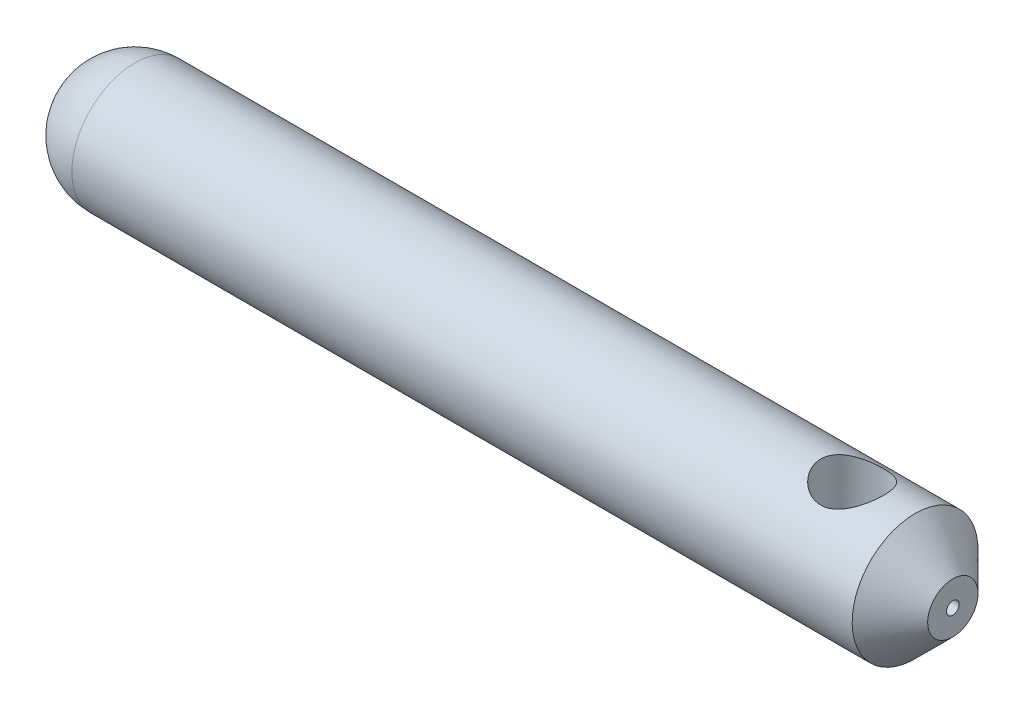
ISO-10303-21;
HEADER;
FILE_DESCRIPTION(('STEP AP214'),'2;1');
FILE_NAME('part.step','',(''),(''),'','','');
FILE_SCHEMA(('AUTOMOTIVE_DESIGN { 1 0 10303 214 1 1 1 1 }'));
ENDSEC;
DATA;
#1=APPLICATION_CONTEXT('core data for automotive mechanical design processes');
#2=APPLICATION_PROTOCOL_DEFINITION('international standard','automotive_design',2000,#1);
#3=PRODUCT_CONTEXT('',#1,'mechanical');
#4=PRODUCT('Part','Part','',(#3));
#5=PRODUCT_RELATED_PRODUCT_CATEGORY('part','',(#4));
#6=PRODUCT_DEFINITION_FORMATION('','',#4);
#7=PRODUCT_DEFINITION_CONTEXT('part definition',#1,'design');
#8=PRODUCT_DEFINITION('design','',#6,#7);
#9=PRODUCT_DEFINITION_SHAPE('','',#8);
#10=(LENGTH_UNIT() NAMED_UNIT(*) SI_UNIT(.MILLI.,.METRE.));
#11=(NAMED_UNIT(*) PLANE_ANGLE_UNIT() SI_UNIT($,.RADIAN.));
#12=(NAMED_UNIT(*) SI_UNIT($,.STERADIAN.) SOLID_ANGLE_UNIT());
#13=UNCERTAINTY_MEASURE_WITH_UNIT(LENGTH_MEASURE(1.E-05),#10,'distance_accuracy_value','');
#14=(GEOMETRIC_REPRESENTATION_CONTEXT(3) GLOBAL_UNCERTAINTY_ASSIGNED_CONTEXT((#13)) GLOBAL_UNIT_ASSIGNED_CONTEXT((#10,
#11,#12)) REPRESENTATION_CONTEXT('',''));
#15=CARTESIAN_POINT('',(0.,0.,0.));
#16=DIRECTION('',(0.,0.,1.));
#17=DIRECTION('',(1.,0.,0.));
#18=AXIS2_PLACEMENT_3D('',#15,#16,#17);
#19=CARTESIAN_POINT('',(-1.90397170928587,-0.388772550549885,0.));
#20=DIRECTION('',(1.,0.,0.));
#21=DIRECTION('',(0.,1.,0.));
#22=AXIS2_PLACEMENT_3D('',#19,#20,#21);
#23=SPHERICAL_SURFACE('',#22,5.);
#24=CARTESIAN_POINT('',(-1.90397170928587,-0.388772550549885,0.));
#25=DIRECTION('',(1.,0.,0.));
#26=DIRECTION('',(0.,1.,0.));
#27=AXIS2_PLACEMENT_3D('',#24,#25,#26);
#28=CIRCLE('',#27,5.);
#29=CARTESIAN_POINT('',(-1.90397170928587,4.61122744945011,0.));
#30=VERTEX_POINT('',#29);
#31=EDGE_CURVE('E10',#30,#30,#28,.T.);
#32=ORIENTED_EDGE('',*,*,#31,.F.);
#33=EDGE_LOOP('',(#32));
#34=FACE_BOUND('',#33,.T.);
#35=ADVANCED_FACE('F30',(#34),#23,.T.);
#36=CARTESIAN_POINT('',(63.0960282907141,-0.388772550549876,0.));
#37=DIRECTION('',(1.,0.,0.));
#38=DIRECTION('',(0.,1.,0.));
#39=AXIS2_PLACEMENT_3D('',#36,#37,#38);
#40=CYLINDRICAL_SURFACE('',#39,5.);
#41=CARTESIAN_POINT('',(52.5960282907141,4.61122744945012,0.));
#42=CARTESIAN_POINT('',(52.5960379597702,4.61121922495484,0.131426682334305));
#43=CARTESIAN_POINT('',(52.6064538524882,4.60598944080289,0.263015634437213));
#44=CARTESIAN_POINT('',(52.6476601118762,4.58558163506031,0.522301454622883));
#45=CARTESIAN_POINT('',(52.6784891716392,4.57038472132682,0.649990448564105));
#46=CARTESIAN_POINT('',(52.759012913433,4.53163435867489,0.897333631316202));
#47=CARTESIAN_POINT('',(52.8086342784969,4.50811340852271,1.01701694536277));
#48=CARTESIAN_POINT('',(52.9249548169659,4.45487188270839,1.24618160399671));
#49=CARTESIAN_POINT('',(52.9916526438592,4.42515179589433,1.3556637520377));
#50=CARTESIAN_POINT('',(53.1448214223568,4.36013389995643,1.56876952630998));
#51=CARTESIAN_POINT('',(53.2322444909439,4.32460742604102,1.67163802294308));
#52=CARTESIAN_POINT('',(53.4223319866994,4.25272670721743,1.86194861703333));
#53=CARTESIAN_POINT('',(53.5250079195542,4.21637185511909,1.94937895911556));
#54=CARTESIAN_POINT('',(53.7522366651594,4.14370122890633,2.11312999967247));
#55=CARTESIAN_POINT('',(53.8778685367492,4.10760712357578,2.18806333849064));
#56=CARTESIAN_POINT('',(54.1419466305096,4.04337691888567,2.31542056761491));
#57=CARTESIAN_POINT('',(54.2803836124768,4.01523513965804,2.36786053751683));
#58=CARTESIAN_POINT('',(54.5576910543106,3.97267412536413,2.44533110537653));
#59=CARTESIAN_POINT('',(54.6960394208937,3.95753423903464,2.47181464267578));
#60=CARTESIAN_POINT('',(54.9759753851517,3.94077469817162,2.50106748329741));
#61=CARTESIAN_POINT('',(55.1175596428892,3.93914168303441,2.50386022093906));
#62=CARTESIAN_POINT('',(55.381743351505,3.94900070587948,2.48671821792512));
#63=CARTESIAN_POINT('',(55.5045883687724,3.95894654099996,2.46946139884055));
#64=CARTESIAN_POINT('',(55.7453330641461,3.98813316779687,2.41734962264384));
#65=CARTESIAN_POINT('',(55.8632311539773,4.00737692024466,2.38248905974454));
#66=CARTESIAN_POINT('',(56.0941011221285,4.0534143597685,2.29552445096459));
#67=CARTESIAN_POINT('',(56.2068942876787,4.08037346605004,2.24303766778988));
#68=CARTESIAN_POINT('',(56.4226140221891,4.13881255648525,2.12260421917012));
#69=CARTESIAN_POINT('',(56.5255361297144,4.17029456895489,2.0546506095312));
#70=CARTESIAN_POINT('',(56.7323314225722,4.23905639703225,1.89516513728193));
#71=CARTESIAN_POINT('',(56.8346704746546,4.27656520536877,1.80173614592319));
#72=CARTESIAN_POINT('',(57.0228668371914,4.3499180319603,1.59888894685344));
#73=CARTESIAN_POINT('',(57.1087162707989,4.38576124842015,1.48946314143572));
#74=CARTESIAN_POINT('',(57.2652424432885,4.45377713152421,1.25129126457962));
#75=CARTESIAN_POINT('',(57.3350294718285,4.48570205350027,1.12188397899853));
#76=CARTESIAN_POINT('',(57.4512708633217,4.5401744774812,0.851165538721987));
#77=CARTESIAN_POINT('',(57.497743753252,4.56272942303905,0.709863940663163));
#78=CARTESIAN_POINT('',(57.5622168000058,4.59433579298591,0.431916229151782));
#79=CARTESIAN_POINT('',(57.5822563800811,4.60435090698252,0.295853826370908));
#80=CARTESIAN_POINT('',(57.5996901185503,4.61305278592805,0.0219489998732918));
#81=CARTESIAN_POINT('',(57.5970950048126,4.61174491748438,-0.115892549675105));
#82=CARTESIAN_POINT('',(57.5705115696674,4.5985072557848,-0.378082429964652));
#83=CARTESIAN_POINT('',(57.5481969588897,4.58740859165004,-0.502648520123703));
#84=CARTESIAN_POINT('',(57.4854331109758,4.55678173232541,-0.746017230755969));
#85=CARTESIAN_POINT('',(57.4449818745783,4.53725260782636,-0.86481921423188));
#86=CARTESIAN_POINT('',(57.3460321246338,4.49083373477341,-1.09722152111964));
#87=CARTESIAN_POINT('',(57.2870506654318,4.46374949362885,-1.2105759924983));
#88=CARTESIAN_POINT('',(57.1532594515893,4.40482680744762,-1.42615340426438));
#89=CARTESIAN_POINT('',(57.0784429541943,4.37298633885546,-1.52837157450203));
#90=CARTESIAN_POINT('',(56.9066272274233,4.30393298260099,-1.72941922315487));
#91=CARTESIAN_POINT('',(56.8081711197389,4.266499569545,-1.82693019428495));
#92=CARTESIAN_POINT('',(56.5962154126647,4.19278723866599,-2.00464080257219));
#93=CARTESIAN_POINT('',(56.4827054936443,4.15650913417419,-2.08482846428685));
#94=CARTESIAN_POINT('',(56.2369191552295,4.08750725490291,-2.22926978618995));
#95=CARTESIAN_POINT('',(56.104000125423,4.05504068926266,-2.29256373922244));
#96=CARTESIAN_POINT('',(55.8272531218316,4.00057925671757,-2.39520706511459));
#97=CARTESIAN_POINT('',(55.6834394747142,3.97857090494026,-2.43458729077056));
#98=CARTESIAN_POINT('',(55.4037527333512,3.95026497514363,-2.48465421767005));
#99=CARTESIAN_POINT('',(55.2684426565952,3.94266203619108,-2.49773248744361));
#100=CARTESIAN_POINT('',(54.9974106233335,3.9403613153759,-2.50172288950899));
#101=CARTESIAN_POINT('',(54.8616888708405,3.94565793970122,-2.49264462983266));
#102=CARTESIAN_POINT('',(54.6073195350973,3.96717400109675,-2.45481530197332));
#103=CARTESIAN_POINT('',(54.4882771089934,3.98230481283144,-2.42802074302696));
#104=CARTESIAN_POINT('',(54.2565079985142,4.02050285282614,-2.35793843840544));
#105=CARTESIAN_POINT('',(54.1437833591476,4.04357263379977,-2.31464538728733));
#106=CARTESIAN_POINT('',(53.9194661379944,4.09694071378424,-2.20953919315539));
#107=CARTESIAN_POINT('',(53.8084584389791,4.12762052943461,-2.14667719009404));
#108=CARTESIAN_POINT('',(53.5978420474741,4.19211072022467,-2.00537808387991));
#109=CARTESIAN_POINT('',(53.4982393280854,4.22592271915778,-1.92693287765889));
#110=CARTESIAN_POINT('',(53.3006729269645,4.29778561272022,-1.74550556946066));
#111=CARTESIAN_POINT('',(53.2043789265428,4.33585236459992,-1.6407002246921));
#112=CARTESIAN_POINT('',(53.0303724412861,4.40817092328557,-1.41539785420685));
#113=CARTESIAN_POINT('',(52.9526699721083,4.44242066850458,-1.29489242426333));
#114=CARTESIAN_POINT('',(52.81793131123,4.50367894402794,-1.03978808878537));
#115=CARTESIAN_POINT('',(52.7610451229297,4.530634563825,-0.905095560782295));
#116=CARTESIAN_POINT('',(52.6938444319218,4.56300705868362,-0.69632870925736));
#117=CARTESIAN_POINT('',(52.6744728927123,4.57245059026886,-0.625670413494097));
#118=CARTESIAN_POINT('',(52.6419623423435,4.58839872220112,-0.482623997839266));
#119=CARTESIAN_POINT('',(52.6288195240378,4.59490511768171,-0.410236963092408));
#120=CARTESIAN_POINT('',(52.6112908184295,4.60360945711142,-0.281518684621676));
#121=CARTESIAN_POINT('',(52.6055733541828,4.60646033411466,-0.225408499555448));
#122=CARTESIAN_POINT('',(52.5979399612484,4.6102711227467,-0.11287552845629));
#123=CARTESIAN_POINT('',(52.5960241374887,4.61123098218209,-0.0564527338382188));
#124=CARTESIAN_POINT('',(52.5960282907141,4.61122744945012,0.));
#125=B_SPLINE_CURVE_WITH_KNOTS('',3,(#41,#42,#43,#44,#45,#46,#47,#48,#49,#50,#51,#52,#53,#54,
#55,#56,#57,#58,#59,#60,#61,#62,#63,#64,#65,#66,#67,#68,#69,#70,#71,#72,#73,#74,#75,#76,#77,#78,
#79,#80,#81,#82,#83,#84,#85,#86,#87,#88,#89,#90,#91,#92,#93,#94,#95,#96,#97,#98,#99,#100,#101,
#102,#103,#104,#105,#106,#107,#108,#109,#110,#111,#112,#113,#114,#115,#116,#117,#118,#119,#120,
#121,#122,#123,#124),.UNSPECIFIED.,.T.,.F.,(4,2,2,2,2,2,2,2,2,2,2,2,2,2,2,2,2,2,2,2,2,2,2,2,2,2,
2,2,2,2,2,2,2,2,2,2,2,2,2,2,2,4),(0.,0.394060643550731,0.788870374272994,1.18215538873075,
1.57540940145392,1.99245439679523,2.40981559413509,2.85954316076882,3.30894869745702,
3.73145030350574,4.15353393322552,4.52514281023301,4.89687009814197,5.27725600421219,
5.65781303150555,6.08662353334697,6.51563836496716,6.96457555536102,7.41315542280699,
7.82458226178364,8.2358141127869,8.61517266265305,8.99457304077329,9.38482140069747,
9.77523626870848,10.2039902661037,10.6330397153795,11.0828670540368,11.53211279863,
11.9382326875699,12.3441764966107,12.7114482562151,13.0788382197025,13.4709114195009,
13.8631890285845,14.303131068923,14.7433095845248,15.1866003415819,15.407934939208,
15.6291340766843,15.7983933645035,15.9676573239323),.UNSPECIFIED.);
#126=CARTESIAN_POINT('',(52.5960282907141,4.61122744945012,0.));
#127=VERTEX_POINT('',#126);
#128=EDGE_CURVE('E69',#127,#127,#125,.T.);
#129=ORIENTED_EDGE('',*,*,#128,.F.);
#130=EDGE_LOOP('',(#129));
#131=FACE_BOUND('',#130,.T.);
#132=CARTESIAN_POINT('',(52.5960282907141,-5.38877255054987,0.));
#133=CARTESIAN_POINT('',(52.5960379597702,-5.38876432605459,-0.131426682334305));
#134=CARTESIAN_POINT('',(52.6064538524882,-5.38353454190265,-0.263015634437213));
#135=CARTESIAN_POINT('',(52.6476601118762,-5.36312673616007,-0.522301454622883));
#136=CARTESIAN_POINT('',(52.6784891716392,-5.34792982242658,-0.649990448564105));
#137=CARTESIAN_POINT('',(52.759012913433,-5.30917945977464,-0.897333631316203));
#138=CARTESIAN_POINT('',(52.8086342784969,-5.28565850962247,-1.01701694536277));
#139=CARTESIAN_POINT('',(52.9249548169659,-5.23241698380815,-1.24618160399671));
#140=CARTESIAN_POINT('',(52.9916526438592,-5.20269689699408,-1.3556637520377));
#141=CARTESIAN_POINT('',(53.1448214223568,-5.13767900105619,-1.56876952630998));
#142=CARTESIAN_POINT('',(53.2322444909439,-5.10215252714078,-1.67163802294308));
#143=CARTESIAN_POINT('',(53.4223319866994,-5.03027180831718,-1.86194861703332));
#144=CARTESIAN_POINT('',(53.5250079195542,-4.99391695621885,-1.94937895911555));
#145=CARTESIAN_POINT('',(53.7522366651594,-4.92124633000609,-2.11312999967247));
#146=CARTESIAN_POINT('',(53.8778685367492,-4.88515222467554,-2.18806333849064));
#147=CARTESIAN_POINT('',(54.1419466305096,-4.82092201998542,-2.31542056761491));
#148=CARTESIAN_POINT('',(54.2803836124768,-4.79278024075779,-2.36786053751683));
#149=CARTESIAN_POINT('',(54.5576910543106,-4.75021922646389,-2.44533110537653));
#150=CARTESIAN_POINT('',(54.6960394208937,-4.73507934013439,-2.47181464267578));
#151=CARTESIAN_POINT('',(54.9759753851518,-4.71831979927137,-2.50106748329741));
#152=CARTESIAN_POINT('',(55.1175596428892,-4.71668678413417,-2.50386022093906));
#153=CARTESIAN_POINT('',(55.381743351505,-4.72654580697924,-2.48671821792512));
#154=CARTESIAN_POINT('',(55.5045883687724,-4.73649164209971,-2.46946139884055));
#155=CARTESIAN_POINT('',(55.7453330641461,-4.76567826889662,-2.41734962264384));
#156=CARTESIAN_POINT('',(55.8632311539773,-4.78492202134441,-2.38248905974454));
#157=CARTESIAN_POINT('',(56.0941011221285,-4.83095946086826,-2.29552445096459));
#158=CARTESIAN_POINT('',(56.2068942876787,-4.8579185671498,-2.24303766778988));
#159=CARTESIAN_POINT('',(56.4226140221891,-4.916357657585,-2.12260421917012));
#160=CARTESIAN_POINT('',(56.5255361297144,-4.94783967005465,-2.0546506095312));
#161=CARTESIAN_POINT('',(56.7323314225722,-5.016601498132,-1.89516513728194));
#162=CARTESIAN_POINT('',(56.8346704746546,-5.05411030646852,-1.8017361459232));
#163=CARTESIAN_POINT('',(57.0228668371914,-5.12746313306006,-1.59888894685345));
#164=CARTESIAN_POINT('',(57.1087162707989,-5.1633063495199,-1.48946314143572));
#165=CARTESIAN_POINT('',(57.2652424432885,-5.23132223262396,-1.25129126457963));
#166=CARTESIAN_POINT('',(57.3350294718285,-5.26324715460002,-1.12188397899853));
#167=CARTESIAN_POINT('',(57.4512708633217,-5.31771957858096,-0.851165538721991));
#168=CARTESIAN_POINT('',(57.497743753252,-5.34027452413881,-0.709863940663168));
#169=CARTESIAN_POINT('',(57.5622168000058,-5.37188089408566,-0.431916229151785));
#170=CARTESIAN_POINT('',(57.5822563800811,-5.38189600808227,-0.29585382637091));
#171=CARTESIAN_POINT('',(57.5996901185503,-5.39059788702781,-0.0219489998732912));
#172=CARTESIAN_POINT('',(57.5970950048126,-5.38929001858413,0.115892549675107));
#173=CARTESIAN_POINT('',(57.5705115696675,-5.37605235688456,0.378082429964653));
#174=CARTESIAN_POINT('',(57.5481969588897,-5.3649536927498,0.502648520123703));
#175=CARTESIAN_POINT('',(57.4854331109758,-5.33432683342516,0.746017230755969));
#176=CARTESIAN_POINT('',(57.4449818745783,-5.31479770892612,0.86481921423188));
#177=CARTESIAN_POINT('',(57.3460321246338,-5.26837883587316,1.09722152111964));
#178=CARTESIAN_POINT('',(57.2870506654318,-5.24129459472861,1.21057599249831));
#179=CARTESIAN_POINT('',(57.1532594515893,-5.18237190854738,1.42615340426438));
#180=CARTESIAN_POINT('',(57.0784429541943,-5.15053143995521,1.52837157450203));
#181=CARTESIAN_POINT('',(56.9066272274233,-5.08147808370074,1.72941922315487));
#182=CARTESIAN_POINT('',(56.8081711197389,-5.04404467064475,1.82693019428495));
#183=CARTESIAN_POINT('',(56.5962154126647,-4.97033233976575,2.0046408025722));
#184=CARTESIAN_POINT('',(56.4827054936443,-4.93405423527394,2.08482846428685));
#185=CARTESIAN_POINT('',(56.2369191552295,-4.86505235600267,2.22926978618995));
#186=CARTESIAN_POINT('',(56.104000125423,-4.83258579036241,2.29256373922243));
#187=CARTESIAN_POINT('',(55.8272531218316,-4.77812435781733,2.39520706511459));
#188=CARTESIAN_POINT('',(55.6834394747142,-4.75611600604001,2.43458729077056));
#189=CARTESIAN_POINT('',(55.4037527333512,-4.72781007624338,2.48465421767005));
#190=CARTESIAN_POINT('',(55.2684426565952,-4.72020713729083,2.49773248744361));
#191=CARTESIAN_POINT('',(54.9974106233335,-4.71790641647566,2.50172288950899));
#192=CARTESIAN_POINT('',(54.8616888708405,-4.72320304080097,2.49264462983266));
#193=CARTESIAN_POINT('',(54.6073195350973,-4.7447191021965,2.45481530197332));
#194=CARTESIAN_POINT('',(54.4882771089934,-4.7598499139312,2.42802074302696));
#195=CARTESIAN_POINT('',(54.2565079985142,-4.7980479539259,2.35793843840544));
#196=CARTESIAN_POINT('',(54.1437833591476,-4.82111773489952,2.31464538728732));
#197=CARTESIAN_POINT('',(53.9194661379944,-4.874485814884,2.20953919315538));
#198=CARTESIAN_POINT('',(53.8084584389791,-4.90516563053437,2.14667719009404));
#199=CARTESIAN_POINT('',(53.5978420474741,-4.96965582132442,2.0053780838799));
#200=CARTESIAN_POINT('',(53.4982393280854,-5.00346782025754,1.92693287765889));
#201=CARTESIAN_POINT('',(53.3006729269645,-5.07533071381998,1.74550556946066));
#202=CARTESIAN_POINT('',(53.2043789265428,-5.11339746569967,1.6407002246921));
#203=CARTESIAN_POINT('',(53.0303724412861,-5.18571602438532,1.41539785420684));
#204=CARTESIAN_POINT('',(52.9526699721083,-5.21996576960433,1.29489242426333));
#205=CARTESIAN_POINT('',(52.81793131123,-5.28122404512769,1.03978808878537));
#206=CARTESIAN_POINT('',(52.7610451229297,-5.30817966492475,0.905095560782296));
#207=CARTESIAN_POINT('',(52.6938444319218,-5.34055215978338,0.696328709257361));
#208=CARTESIAN_POINT('',(52.6744728927123,-5.34999569136861,0.625670413494098));
#209=CARTESIAN_POINT('',(52.6419623423435,-5.36594382330088,0.482623997839267));
#210=CARTESIAN_POINT('',(52.6288195240378,-5.37245021878146,0.41023696309241));
#211=CARTESIAN_POINT('',(52.6112908184295,-5.38115455821117,0.281518684621679));
#212=CARTESIAN_POINT('',(52.6055733541828,-5.38400543521442,0.225408499555451));
#213=CARTESIAN_POINT('',(52.5979399612484,-5.38781622384646,0.112875528456293));
#214=CARTESIAN_POINT('',(52.5960241374887,-5.38877608328185,0.0564527338382199));
#215=CARTESIAN_POINT('',(52.5960282907141,-5.38877255054987,0.));
#216=B_SPLINE_CURVE_WITH_KNOTS('',3,(#132,#133,#134,#135,#136,#137,#138,#139,#140,#141,#142,
#143,#144,#145,#146,#147,#148,#149,#150,#151,#152,#153,#154,#155,#156,#157,#158,#159,#160,#161,
#162,#163,#164,#165,#166,#167,#168,#169,#170,#171,#172,#173,#174,#175,#176,#177,#178,#179,#180,
#181,#182,#183,#184,#185,#186,#187,#188,#189,#190,#191,#192,#193,#194,#195,#196,#197,#198,#199,
#200,#201,#202,#203,#204,#205,#206,#207,#208,#209,#210,#211,#212,#213,#214,#215),.UNSPECIFIED.,
.T.,.F.,(4,2,2,2,2,2,2,2,2,2,2,2,2,2,2,2,2,2,2,2,2,2,2,2,2,2,2,2,2,2,2,2,2,2,2,2,2,2,2,2,2,4),
(0.,0.394060643550732,0.788870374272993,1.18215538873074,1.57540940145392,1.99245439679522,
2.40981559413509,2.85954316076882,3.30894869745702,3.73145030350574,4.15353393322551,
4.52514281023303,4.89687009814197,5.27725600421219,5.65781303150555,6.08662353334697,
6.51563836496716,6.96457555536102,7.41315542280699,7.82458226178364,8.23581411278691,
8.61517266265305,8.99457304077329,9.38482140069747,9.77523626870849,10.2039902661037,
10.6330397153795,11.0828670540368,11.53211279863,11.9382326875699,12.3441764966107,
12.7114482562151,13.0788382197025,13.4709114195009,13.8631890285845,14.303131068923,
14.7433095845248,15.1866003415819,15.407934939208,15.6291340766843,15.7983933645035,
15.9676573239323),.UNSPECIFIED.);
#217=CARTESIAN_POINT('',(52.5960282907141,-5.38877255054987,0.));
#218=VERTEX_POINT('',#217);
#219=EDGE_CURVE('E74',#218,#218,#216,.T.);
#220=ORIENTED_EDGE('',*,*,#219,.F.);
#221=EDGE_LOOP('',(#220));
#222=FACE_BOUND('',#221,.T.);
#223=ORIENTED_EDGE('',*,*,#31,.T.);
#224=EDGE_LOOP('',(#223));
#225=FACE_BOUND('',#224,.T.);
#226=CARTESIAN_POINT('',(60.0960282907141,-0.388772550549877,0.));
#227=DIRECTION('',(1.,0.,0.));
#228=DIRECTION('',(0.,1.,0.));
#229=AXIS2_PLACEMENT_3D('',#226,#227,#228);
#230=CIRCLE('',#229,4.99999999999999);
#231=CARTESIAN_POINT('',(60.0960282907141,4.61122744945011,0.));
#232=VERTEX_POINT('',#231);
#233=EDGE_CURVE('E42',#232,#232,#230,.T.);
#234=ORIENTED_EDGE('',*,*,#233,.F.);
#235=EDGE_LOOP('',(#234));
#236=FACE_BOUND('',#235,.T.);
#237=ADVANCED_FACE('F79',(#131,#222,#225,#236),#40,.T.);
#238=CARTESIAN_POINT('',(63.0960282907141,-0.388772550549876,0.));
#239=DIRECTION('',(-1.,0.,0.));
#240=DIRECTION('',(0.,-1.,0.));
#241=AXIS2_PLACEMENT_3D('',#238,#239,#240);
#242=CONICAL_SURFACE('',#241,2.,0.785398163397449);
#243=ORIENTED_EDGE('',*,*,#233,.T.);
#244=EDGE_LOOP('',(#243));
#245=FACE_BOUND('',#244,.T.);
#246=CARTESIAN_POINT('',(63.0960282907141,-0.388772550549876,0.));
#247=DIRECTION('',(1.,0.,0.));
#248=DIRECTION('',(0.,1.,0.));
#249=AXIS2_PLACEMENT_3D('',#246,#247,#248);
#250=CIRCLE('',#249,2.);
#251=CARTESIAN_POINT('',(63.0960282907141,1.61122744945012,0.));
#252=VERTEX_POINT('',#251);
#253=EDGE_CURVE('E47',#252,#252,#250,.T.);
#254=ORIENTED_EDGE('',*,*,#253,.F.);
#255=EDGE_LOOP('',(#254));
#256=FACE_BOUND('',#255,.T.);
#257=ADVANCED_FACE('F83',(#245,#256),#242,.T.);
#258=CARTESIAN_POINT('',(63.0960282907141,1.61122744945012,0.));
#259=DIRECTION('',(1.,0.,0.));
#260=DIRECTION('',(0.,1.,0.));
#261=AXIS2_PLACEMENT_3D('',#258,#259,#260);
#262=PLANE('',#261);
#263=CARTESIAN_POINT('',(63.0960282907141,-0.388772550549876,0.));
#264=DIRECTION('',(1.,0.,0.));
#265=DIRECTION('',(0.,1.,0.));
#266=AXIS2_PLACEMENT_3D('',#263,#264,#265);
#267=CIRCLE('',#266,0.5);
#268=CARTESIAN_POINT('',(63.0960282907141,0.111227449450124,0.));
#269=VERTEX_POINT('',#268);
#270=EDGE_CURVE('E152',#269,#269,#267,.T.);
#271=ORIENTED_EDGE('',*,*,#270,.F.);
#272=EDGE_LOOP('',(#271));
#273=FACE_BOUND('',#272,.T.);
#274=ORIENTED_EDGE('',*,*,#253,.T.);
#275=EDGE_LOOP('',(#274));
#276=FACE_BOUND('',#275,.T.);
#277=ADVANCED_FACE('F87',(#273,#276),#262,.T.);
#278=CARTESIAN_POINT('',(3.09602829071413,-0.388772550549884,0.));
#279=DIRECTION('',(1.,0.,0.));
#280=DIRECTION('',(0.,1.,0.));
#281=AXIS2_PLACEMENT_3D('',#278,#279,#280);
#282=CYLINDRICAL_SURFACE('',#281,0.5);
#283=CARTESIAN_POINT('',(57.5960282907141,0.111227449450123,0.));
#284=CARTESIAN_POINT('',(57.5960277786185,0.11122642720095,-0.0277884533963166));
#285=CARTESIAN_POINT('',(57.5955602166053,0.1089030279663,-0.0555898301007611));
#286=CARTESIAN_POINT('',(57.5937401188303,0.0996781993925001,-0.11040675384451));
#287=CARTESIAN_POINT('',(57.5923868800151,0.0927731330493681,-0.137421658770678));
#288=CARTESIAN_POINT('',(57.5889465371056,0.0746068126397284,-0.189865152631656));
#289=CARTESIAN_POINT('',(57.5868601360977,0.0633497310277789,-0.215295233966567));
#290=CARTESIAN_POINT('',(57.5821802808907,0.0368113256944759,-0.263903994432112));
#291=CARTESIAN_POINT('',(57.5795868568927,0.0215302416465205,-0.287082807537906));
#292=CARTESIAN_POINT('',(57.574139117364,-0.0128417976955935,-0.330846738657432));
#293=CARTESIAN_POINT('',(57.5712820182359,-0.0319767282454774,-0.351396975579261));
#294=CARTESIAN_POINT('',(57.5656491929771,-0.0734187587457275,-0.389018378304013));
#295=CARTESIAN_POINT('',(57.5628734732163,-0.0957261062174359,-0.406089272385212));
#296=CARTESIAN_POINT('',(57.5576904997772,-0.143130647055814,-0.43641587667381));
#297=CARTESIAN_POINT('',(57.5552868275389,-0.168251372448056,-0.449635469432933));
#298=CARTESIAN_POINT('',(57.5511596310062,-0.220413460051916,-0.471652833290154));
#299=CARTESIAN_POINT('',(57.549436039524,-0.247454632223049,-0.480451041218619));
#300=CARTESIAN_POINT('',(57.5468923169752,-0.302314732503835,-0.493262649942413));
#301=CARTESIAN_POINT('',(57.5460606412501,-0.33011882262099,-0.497337248979388));
#302=CARTESIAN_POINT('',(57.5453601660173,-0.386027461232048,-0.50077606386306));
#303=CARTESIAN_POINT('',(57.5454912680533,-0.41413197870995,-0.50014076135675));
#304=CARTESIAN_POINT('',(57.5466910464551,-0.469395944560379,-0.494227286550909));
#305=CARTESIAN_POINT('',(57.547745555008,-0.496563253363534,-0.489019270121953));
#306=CARTESIAN_POINT('',(57.5506510215142,-0.549630588881378,-0.474218942311525));
#307=CARTESIAN_POINT('',(57.552502017503,-0.575530555009381,-0.46462642155034));
#308=CARTESIAN_POINT('',(57.5568063832162,-0.625530181401676,-0.44126239183736));
#309=CARTESIAN_POINT('',(57.5592637397827,-0.649616490334463,-0.427463075616057));
#310=CARTESIAN_POINT('',(57.5645013845795,-0.695157975536284,-0.39609678728634));
#311=CARTESIAN_POINT('',(57.567281709906,-0.716612848975456,-0.378529382178414));
#312=CARTESIAN_POINT('',(57.5729133969215,-0.756687251778345,-0.339749967280292));
#313=CARTESIAN_POINT('',(57.5757651367687,-0.775248834479442,-0.318478080606222));
#314=CARTESIAN_POINT('',(57.5811725342862,-0.808549473700489,-0.273092512031005));
#315=CARTESIAN_POINT('',(57.583728188159,-0.823288481196667,-0.248978793689695));
#316=CARTESIAN_POINT('',(57.5882617415186,-0.848536305162865,-0.19852969343946));
#317=CARTESIAN_POINT('',(57.5902387349555,-0.859038497372146,-0.17219090979265));
#318=CARTESIAN_POINT('',(57.5933853356534,-0.87545278756916,-0.118074488224332));
#319=CARTESIAN_POINT('',(57.5945550407168,-0.881365441586691,-0.0902970250362245));
#320=CARTESIAN_POINT('',(57.5959416500485,-0.888350777447016,-0.0345897028135751));
#321=CARTESIAN_POINT('',(57.5961741639765,-0.889502760320011,-0.00667016416278805));
#322=CARTESIAN_POINT('',(57.5957035503647,-0.887147621078787,0.048962467096357));
#323=CARTESIAN_POINT('',(57.5950004754214,-0.883640760873579,0.0766755712218965));
#324=CARTESIAN_POINT('',(57.5927474507542,-0.872133363777899,0.13085282997327));
#325=CARTESIAN_POINT('',(57.5912051727352,-0.864173516300926,0.157325974169951));
#326=CARTESIAN_POINT('',(57.5874460510193,-0.844030559221973,0.208561813749833));
#327=CARTESIAN_POINT('',(57.5852291567853,-0.831847133211462,0.233324380818769));
#328=CARTESIAN_POINT('',(57.5803278483806,-0.803431305224221,0.280770586843108));
#329=CARTESIAN_POINT('',(57.5776380428994,-0.787151160030405,0.303425063376093));
#330=CARTESIAN_POINT('',(57.5721019648636,-0.751067954946237,0.345709009559603));
#331=CARTESIAN_POINT('',(57.5692556755561,-0.731264517349944,0.365338154465381));
#332=CARTESIAN_POINT('',(57.563674808499,-0.688335874604316,0.401320295387088));
#333=CARTESIAN_POINT('',(57.5609425918807,-0.665164678439209,0.417618851224327));
#334=CARTESIAN_POINT('',(57.5559492496951,-0.616366869871538,0.446092710025603));
#335=CARTESIAN_POINT('',(57.5536881052809,-0.590740355763101,0.458268177961451));
#336=CARTESIAN_POINT('',(57.5499119936361,-0.537888427475103,0.47807592079098));
#337=CARTESIAN_POINT('',(57.5483931650751,-0.510672129944718,0.485731749895525));
#338=CARTESIAN_POINT('',(57.5462654746743,-0.455305823804426,0.496354325813598));
#339=CARTESIAN_POINT('',(57.5456564941697,-0.427155937445204,0.499321684112556));
#340=CARTESIAN_POINT('',(57.545424038871,-0.371268118277718,0.500460455433734));
#341=CARTESIAN_POINT('',(57.5457828866607,-0.343531976086373,0.498717894035448));
#342=CARTESIAN_POINT('',(57.5474061581372,-0.288756725597364,0.49067615205003));
#343=CARTESIAN_POINT('',(57.54867057455,-0.261717611702475,0.484377008064649));
#344=CARTESIAN_POINT('',(57.5519546118099,-0.209158694929605,0.467439284249477));
#345=CARTESIAN_POINT('',(57.5539723958083,-0.18363537029867,0.456811253358672));
#346=CARTESIAN_POINT('',(57.558536865585,-0.134720690182657,0.431527322300802));
#347=CARTESIAN_POINT('',(57.5610835957086,-0.111329513687309,0.416871084387441));
#348=CARTESIAN_POINT('',(57.5664730933303,-0.06691476447472,0.383652957393207));
#349=CARTESIAN_POINT('',(57.5693201552626,-0.0459381679160791,0.36502894361759));
#350=CARTESIAN_POINT('',(57.5749587000739,-0.00737944778529154,0.32453218450657));
#351=CARTESIAN_POINT('',(57.5777501700301,0.0102018946087589,0.302658693576667));
#352=CARTESIAN_POINT('',(57.582997452654,0.0416447714233464,0.256008814544123));
#353=CARTESIAN_POINT('',(57.5854494468104,0.0554654510901356,0.231204442214917));
#354=CARTESIAN_POINT('',(57.5897039161392,0.0787205107484188,0.179583180470366));
#355=CARTESIAN_POINT('',(57.5915069764072,0.0881588442163689,0.152768130431563));
#356=CARTESIAN_POINT('',(57.593910153691,0.100553423472481,0.10491074446189));
#357=CARTESIAN_POINT('',(57.5946998065064,0.104549046304001,0.0841408320068927));
#358=CARTESIAN_POINT('',(57.5957590614136,0.109886405629305,0.0422497626050338));
#359=CARTESIAN_POINT('',(57.5960286800799,0.111228226705007,0.0211286168743096));
#360=CARTESIAN_POINT('',(57.5960282907141,0.111227449450123,0.));
#361=B_SPLINE_CURVE_WITH_KNOTS('',3,(#283,#284,#285,#286,#287,#288,#289,#290,#291,#292,#293,
#294,#295,#296,#297,#298,#299,#300,#301,#302,#303,#304,#305,#306,#307,#308,#309,#310,#311,#312,
#313,#314,#315,#316,#317,#318,#319,#320,#321,#322,#323,#324,#325,#326,#327,#328,#329,#330,#331,
#332,#333,#334,#335,#336,#337,#338,#339,#340,#341,#342,#343,#344,#345,#346,#347,#348,#349,#350,
#351,#352,#353,#354,#355,#356,#357,#358,#359,#360),.UNSPECIFIED.,.T.,.F.,(4,2,2,2,2,2,2,2,2,2,2,
2,2,2,2,2,2,2,2,2,2,2,2,2,2,2,2,2,2,2,2,2,2,2,2,2,2,2,4),(0.,0.0832880653306292,
0.166642325345661,0.24991686762517,0.333186451115431,0.417466335056091,0.501752798373682,
0.586805975029612,0.671850746825986,0.755780925517936,0.839702521406126,0.922358635031391,
1.00501869626865,1.08823745101796,1.17146577374835,1.25619126245675,1.3409178376991,
1.42577637427012,1.51062462849018,1.59405367838133,1.67747803828934,1.76015226975362,
1.84283269608011,1.92652533016679,2.01022694172965,2.09520314289613,2.18017594361733,
2.26470190516361,2.34921684165207,2.43219861283851,2.51517971746304,2.59795980626555,
2.68074683790933,2.76494038119572,2.84915327266465,2.93424748337819,3.01926477758759,
3.08259387644947,3.14592095685498),.UNSPECIFIED.);
#362=CARTESIAN_POINT('',(57.5960282907141,0.111227449450123,0.));
#363=VERTEX_POINT('',#362);
#364=EDGE_CURVE('E50',#363,#363,#361,.T.);
#365=ORIENTED_EDGE('',*,*,#364,.T.);
#366=EDGE_LOOP('',(#365));
#367=FACE_BOUND('',#366,.T.);
#368=ORIENTED_EDGE('',*,*,#270,.T.);
#369=EDGE_LOOP('',(#368));
#370=FACE_BOUND('',#369,.T.);
#371=ADVANCED_FACE('F55',(#367,#370),#282,.F.);
#372=CARTESIAN_POINT('',(55.0960282907141,-5.38877255054989,0.));
#373=DIRECTION('',(0.,1.,0.));
#374=DIRECTION('',(-1.,0.,0.));
#375=AXIS2_PLACEMENT_3D('',#372,#373,#374);
#376=CYLINDRICAL_SURFACE('',#375,2.5);
#377=ORIENTED_EDGE('',*,*,#219,.T.);
#378=EDGE_LOOP('',(#377));
#379=FACE_BOUND('',#378,.T.);
#380=ORIENTED_EDGE('',*,*,#128,.T.);
#381=EDGE_LOOP('',(#380));
#382=FACE_BOUND('',#381,.T.);
#383=ORIENTED_EDGE('',*,*,#364,.F.);
#384=EDGE_LOOP('',(#383));
#385=FACE_BOUND('',#384,.T.);
#386=CARTESIAN_POINT('',(52.5960282907141,0.111227449450122,0.));
#387=CARTESIAN_POINT('',(52.5960288028098,0.11122642720095,0.0277884533963166));
#388=CARTESIAN_POINT('',(52.596496364823,0.108903027966299,0.0555898301007612));
#389=CARTESIAN_POINT('',(52.598316462598,0.0996781993924995,0.11040675384451));
#390=CARTESIAN_POINT('',(52.5996697014132,0.0927731330493674,0.137421658770678));
#391=CARTESIAN_POINT('',(52.6031100443227,0.0746068126397278,0.189865152631656));
#392=CARTESIAN_POINT('',(52.6051964453305,0.0633497310277783,0.215295233966567));
#393=CARTESIAN_POINT('',(52.6098763005376,0.0368113256944753,0.263903994432112));
#394=CARTESIAN_POINT('',(52.6124697245356,0.0215302416465199,0.287082807537905));
#395=CARTESIAN_POINT('',(52.6179174640643,-0.0128417976955945,0.330846738657432));
#396=CARTESIAN_POINT('',(52.6207745631924,-0.0319767282454788,0.351396975579262));
#397=CARTESIAN_POINT('',(52.6264073884512,-0.0734187587457288,0.389018378304014));
#398=CARTESIAN_POINT('',(52.629183108212,-0.0957261062174369,0.406089272385212));
#399=CARTESIAN_POINT('',(52.6343660816511,-0.143130647055815,0.43641587667381));
#400=CARTESIAN_POINT('',(52.6367697538894,-0.168251372448057,0.449635469432933));
#401=CARTESIAN_POINT('',(52.6408969504221,-0.220413460051917,0.471652833290154));
#402=CARTESIAN_POINT('',(52.6426205419043,-0.24745463222305,0.480451041218619));
#403=CARTESIAN_POINT('',(52.6451642644531,-0.302314732503837,0.493262649942414));
#404=CARTESIAN_POINT('',(52.6459959401782,-0.330118822620991,0.497337248979389));
#405=CARTESIAN_POINT('',(52.646696415411,-0.386027461232049,0.50077606386306));
#406=CARTESIAN_POINT('',(52.6465653133749,-0.414131978709951,0.50014076135675));
#407=CARTESIAN_POINT('',(52.6453655349732,-0.46939594456038,0.494227286550909));
#408=CARTESIAN_POINT('',(52.6443110264203,-0.496563253363535,0.489019270121953));
#409=CARTESIAN_POINT('',(52.6414055599141,-0.549630588881379,0.474218942311525));
#410=CARTESIAN_POINT('',(52.6395545639253,-0.575530555009382,0.46462642155034));
#411=CARTESIAN_POINT('',(52.6352501982121,-0.625530181401678,0.44126239183736));
#412=CARTESIAN_POINT('',(52.6327928416456,-0.649616490334464,0.427463075616057));
#413=CARTESIAN_POINT('',(52.6275551968488,-0.695157975536285,0.39609678728634));
#414=CARTESIAN_POINT('',(52.6247748715223,-0.716612848975456,0.378529382178414));
#415=CARTESIAN_POINT('',(52.6191431845068,-0.756687251778346,0.339749967280292));
#416=CARTESIAN_POINT('',(52.6162914446596,-0.775248834479443,0.318478080606223));
#417=CARTESIAN_POINT('',(52.6108840471421,-0.80854947370049,0.273092512031005));
#418=CARTESIAN_POINT('',(52.6083283932693,-0.823288481196667,0.248978793689695));
#419=CARTESIAN_POINT('',(52.6037948399097,-0.848536305162865,0.19852969343946));
#420=CARTESIAN_POINT('',(52.6018178464728,-0.859038497372146,0.17219090979265));
#421=CARTESIAN_POINT('',(52.5986712457749,-0.875452787569161,0.118074488224332));
#422=CARTESIAN_POINT('',(52.5975015407115,-0.881365441586692,0.0902970250362247));
#423=CARTESIAN_POINT('',(52.5961149313798,-0.888350777447016,0.0345897028135753));
#424=CARTESIAN_POINT('',(52.5958824174518,-0.889502760320012,0.00667016416278815));
#425=CARTESIAN_POINT('',(52.5963530310636,-0.887147621078788,-0.048962467096357));
#426=CARTESIAN_POINT('',(52.5970561060069,-0.88364076087358,-0.0766755712218965));
#427=CARTESIAN_POINT('',(52.5993091306741,-0.8721333637779,-0.13085282997327));
#428=CARTESIAN_POINT('',(52.6008514086931,-0.864173516300926,-0.157325974169951));
#429=CARTESIAN_POINT('',(52.604610530409,-0.844030559221973,-0.208561813749833));
#430=CARTESIAN_POINT('',(52.606827424643,-0.831847133211463,-0.233324380818769));
#431=CARTESIAN_POINT('',(52.6117287330477,-0.803431305224221,-0.280770586843109));
#432=CARTESIAN_POINT('',(52.6144185385289,-0.787151160030405,-0.303425063376094));
#433=CARTESIAN_POINT('',(52.6199546165647,-0.751067954946237,-0.345709009559603));
#434=CARTESIAN_POINT('',(52.6228009058722,-0.731264517349945,-0.365338154465381));
#435=CARTESIAN_POINT('',(52.6283817729293,-0.688335874604316,-0.401320295387088));
#436=CARTESIAN_POINT('',(52.6311139895476,-0.665164678439209,-0.417618851224327));
#437=CARTESIAN_POINT('',(52.6361073317332,-0.616366869871538,-0.446092710025603));
#438=CARTESIAN_POINT('',(52.6383684761474,-0.590740355763102,-0.458268177961451));
#439=CARTESIAN_POINT('',(52.6421445877922,-0.537888427475104,-0.47807592079098));
#440=CARTESIAN_POINT('',(52.6436634163532,-0.510672129944718,-0.485731749895525));
#441=CARTESIAN_POINT('',(52.645791106754,-0.455305823804426,-0.496354325813598));
#442=CARTESIAN_POINT('',(52.6464000872586,-0.427155937445204,-0.499321684112556));
#443=CARTESIAN_POINT('',(52.6466325425572,-0.371268118277719,-0.500460455433734));
#444=CARTESIAN_POINT('',(52.6462736947676,-0.343531976086373,-0.498717894035448));
#445=CARTESIAN_POINT('',(52.6446504232911,-0.288756725597365,-0.49067615205003));
#446=CARTESIAN_POINT('',(52.6433860068783,-0.261717611702476,-0.484377008064649));
#447=CARTESIAN_POINT('',(52.6401019696183,-0.209158694929606,-0.467439284249477));
#448=CARTESIAN_POINT('',(52.63808418562,-0.18363537029867,-0.456811253358672));
#449=CARTESIAN_POINT('',(52.6335197158433,-0.134720690182658,-0.431527322300802));
#450=CARTESIAN_POINT('',(52.6309729857197,-0.111329513687309,-0.416871084387441));
#451=CARTESIAN_POINT('',(52.625583488098,-0.0669147644747207,-0.383652957393207));
#452=CARTESIAN_POINT('',(52.6227364261656,-0.0459381679160798,-0.36502894361759));
#453=CARTESIAN_POINT('',(52.6170978813544,-0.00737944778529219,-0.32453218450657));
#454=CARTESIAN_POINT('',(52.6143064113982,0.0102018946087583,-0.302658693576667));
#455=CARTESIAN_POINT('',(52.6090591287743,0.0416447714233456,-0.256008814544124));
#456=CARTESIAN_POINT('',(52.6066071346179,0.0554654510901345,-0.231204442214918));
#457=CARTESIAN_POINT('',(52.6023526652891,0.0787205107484178,-0.179583180470367));
#458=CARTESIAN_POINT('',(52.6005496050211,0.0881588442163681,-0.152768130431563));
#459=CARTESIAN_POINT('',(52.5981464277373,0.10055342347248,-0.10491074446189));
#460=CARTESIAN_POINT('',(52.5973567749219,0.104549046304001,-0.0841408320068927));
#461=CARTESIAN_POINT('',(52.5962975200147,0.109886405629304,-0.0422497626050339));
#462=CARTESIAN_POINT('',(52.5960279013484,0.111228226705006,-0.0211286168743097));
#463=CARTESIAN_POINT('',(52.5960282907141,0.111227449450122,0.));
#464=B_SPLINE_CURVE_WITH_KNOTS('',3,(#386,#387,#388,#389,#390,#391,#392,#393,#394,#395,#396,
#397,#398,#399,#400,#401,#402,#403,#404,#405,#406,#407,#408,#409,#410,#411,#412,#413,#414,#415,
#416,#417,#418,#419,#420,#421,#422,#423,#424,#425,#426,#427,#428,#429,#430,#431,#432,#433,#434,
#435,#436,#437,#438,#439,#440,#441,#442,#443,#444,#445,#446,#447,#448,#449,#450,#451,#452,#453,
#454,#455,#456,#457,#458,#459,#460,#461,#462,#463),.UNSPECIFIED.,.T.,.F.,(4,2,2,2,2,2,2,2,2,2,2,
2,2,2,2,2,2,2,2,2,2,2,2,2,2,2,2,2,2,2,2,2,2,2,2,2,2,2,4),(0.,0.0832880653306293,
0.166642325345661,0.24991686762517,0.333186451115431,0.417466335056092,0.501752798373682,
0.586805975029613,0.671850746825987,0.755780925517937,0.839702521406126,0.922358635031392,
1.00501869626865,1.08823745101796,1.17146577374835,1.25619126245675,1.3409178376991,
1.42577637427012,1.51062462849018,1.59405367838133,1.67747803828934,1.76015226975362,
1.84283269608011,1.92652533016679,2.01022694172965,2.09520314289613,2.18017594361733,
2.26470190516362,2.34921684165207,2.43219861283851,2.51517971746304,2.59795980626555,
2.68074683790933,2.76494038119572,2.84915327266465,2.93424748337818,3.01926477758759,
3.08259387644947,3.14592095685498),.UNSPECIFIED.);
#465=CARTESIAN_POINT('',(52.5960282907141,0.111227449450122,0.));
#466=VERTEX_POINT('',#465);
#467=EDGE_CURVE('E33',#466,#466,#464,.T.);
#468=ORIENTED_EDGE('',*,*,#467,.F.);
#469=EDGE_LOOP('',(#468));
#470=FACE_BOUND('',#469,.T.);
#471=ADVANCED_FACE('F59',(#379,#382,#385,#470),#376,.F.);
#472=CARTESIAN_POINT('',(3.09602829071413,-0.388772550549884,0.));
#473=DIRECTION('',(1.,0.,0.));
#474=DIRECTION('',(0.,1.,0.));
#475=AXIS2_PLACEMENT_3D('',#472,#473,#474);
#476=PLANE('',#475);
#477=CARTESIAN_POINT('',(3.09602829071413,-0.388772550549884,0.));
#478=DIRECTION('',(1.,0.,0.));
#479=DIRECTION('',(0.,1.,0.));
#480=AXIS2_PLACEMENT_3D('',#477,#478,#479);
#481=CIRCLE('',#480,0.5);
#482=CARTESIAN_POINT('',(3.09602829071413,0.111227449450116,0.));
#483=VERTEX_POINT('',#482);
#484=EDGE_CURVE('E151',#483,#483,#481,.T.);
#485=ORIENTED_EDGE('',*,*,#484,.T.);
#486=EDGE_LOOP('',(#485));
#487=FACE_BOUND('',#486,.T.);
#488=ADVANCED_FACE('F62',(#487),#476,.T.);
#489=ORIENTED_EDGE('',*,*,#467,.T.);
#490=EDGE_LOOP('',(#489));
#491=FACE_BOUND('',#490,.T.);
#492=ORIENTED_EDGE('',*,*,#484,.F.);
#493=EDGE_LOOP('',(#492));
#494=FACE_BOUND('',#493,.T.);
#495=ADVANCED_FACE('F95',(#491,#494),#282,.F.);
#496=CLOSED_SHELL('',(#35,#237,#257,#277,#371,#471,#488,#495));
#497=MANIFOLD_SOLID_BREP('B2',#496);
#498=ADVANCED_BREP_SHAPE_REPRESENTATION('',(#18,#497),#14);
#499=SHAPE_DEFINITION_REPRESENTATION(#9,#498);
ENDSEC;
END-ISO-10303-21;
